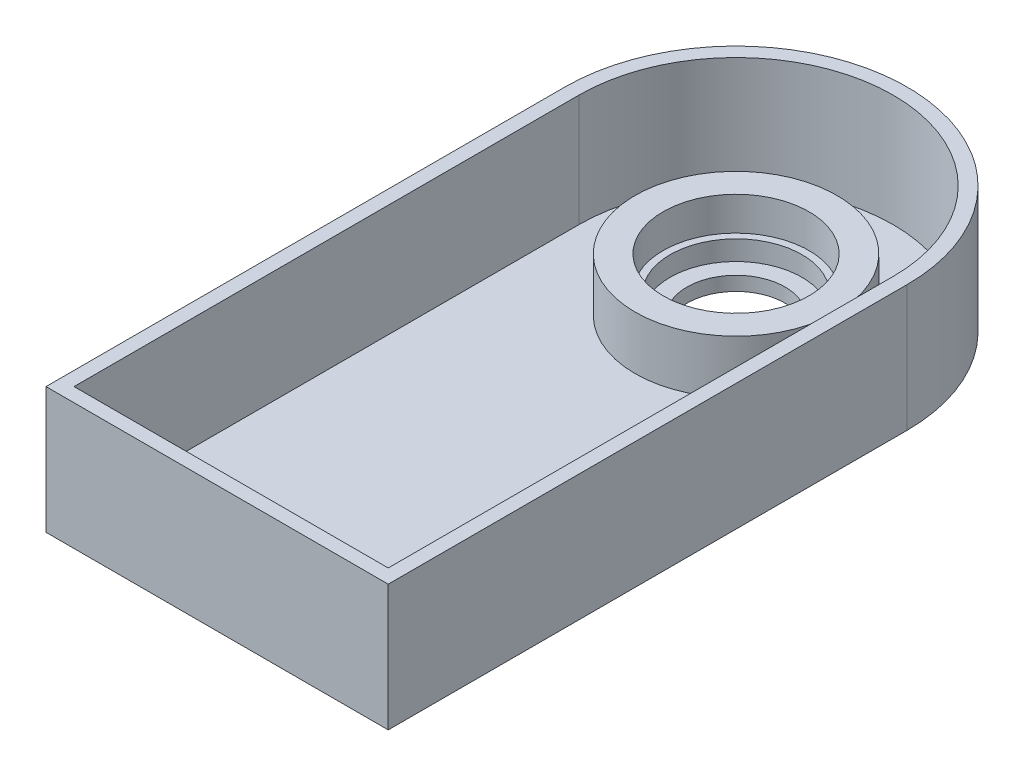
ISO-10303-21;
HEADER;
FILE_DESCRIPTION(('STEP AP214'),'2;1');
FILE_NAME('part.step','',(''),(''),'','','');
FILE_SCHEMA(('AUTOMOTIVE_DESIGN { 1 0 10303 214 1 1 1 1 }'));
ENDSEC;
DATA;
#1=APPLICATION_CONTEXT('core data for automotive mechanical design processes');
#2=APPLICATION_PROTOCOL_DEFINITION('international standard','automotive_design',2000,#1);
#3=PRODUCT_CONTEXT('',#1,'mechanical');
#4=PRODUCT('Part','Part','',(#3));
#5=PRODUCT_RELATED_PRODUCT_CATEGORY('part','',(#4));
#6=PRODUCT_DEFINITION_FORMATION('','',#4);
#7=PRODUCT_DEFINITION_CONTEXT('part definition',#1,'design');
#8=PRODUCT_DEFINITION('design','',#6,#7);
#9=PRODUCT_DEFINITION_SHAPE('','',#8);
#10=(LENGTH_UNIT() NAMED_UNIT(*) SI_UNIT(.MILLI.,.METRE.));
#11=(NAMED_UNIT(*) PLANE_ANGLE_UNIT() SI_UNIT($,.RADIAN.));
#12=(NAMED_UNIT(*) SI_UNIT($,.STERADIAN.) SOLID_ANGLE_UNIT());
#13=UNCERTAINTY_MEASURE_WITH_UNIT(LENGTH_MEASURE(1.E-05),#10,'distance_accuracy_value','');
#14=(GEOMETRIC_REPRESENTATION_CONTEXT(3) GLOBAL_UNCERTAINTY_ASSIGNED_CONTEXT((#13)) GLOBAL_UNIT_ASSIGNED_CONTEXT((#10,
#11,#12)) REPRESENTATION_CONTEXT('',''));
#15=CARTESIAN_POINT('',(0.,0.,0.));
#16=DIRECTION('',(0.,0.,1.));
#17=DIRECTION('',(1.,0.,0.));
#18=AXIS2_PLACEMENT_3D('',#15,#16,#17);
#19=CARTESIAN_POINT('',(0.,5.,0.));
#20=DIRECTION('',(0.,1.,0.));
#21=DIRECTION('',(0.,0.,1.));
#22=AXIS2_PLACEMENT_3D('',#19,#20,#21);
#23=PLANE('',#22);
#24=CARTESIAN_POINT('',(61.,5.,-1.9999999999998));
#25=DIRECTION('',(0.,1.,0.));
#26=DIRECTION('',(0.,0.,1.));
#27=AXIS2_PLACEMENT_3D('',#24,#25,#26);
#28=CIRCLE('',#27,17.5);
#29=CARTESIAN_POINT('',(61.,5.,15.5000000000002));
#30=VERTEX_POINT('',#29);
#31=EDGE_CURVE('E160',#30,#30,#28,.T.);
#32=ORIENTED_EDGE('',*,*,#31,.F.);
#33=EDGE_LOOP('',(#32));
#34=FACE_BOUND('',#33,.T.);
#35=CARTESIAN_POINT('',(61.,5.,-1.9999999999998));
#36=DIRECTION('',(0.,1.,0.));
#37=DIRECTION('',(0.,0.,1.));
#38=AXIS2_PLACEMENT_3D('',#35,#36,#37);
#39=CIRCLE('',#38,23.5);
#40=CARTESIAN_POINT('',(61.,5.,21.5000000000002));
#41=VERTEX_POINT('',#40);
#42=EDGE_CURVE('E12',#41,#41,#39,.F.);
#43=ORIENTED_EDGE('',*,*,#42,.F.);
#44=EDGE_LOOP('',(#43));
#45=FACE_BOUND('',#44,.T.);
#46=ADVANCED_FACE('F62',(#34,#45),#23,.T.);
#47=CARTESIAN_POINT('',(0.,5.,0.));
#48=DIRECTION('',(-1.,0.,0.));
#49=DIRECTION('',(0.,0.,1.));
#50=AXIS2_PLACEMENT_3D('',#47,#48,#49);
#51=PLANE('',#50);
#52=DIRECTION('',(0.,0.,-1.));
#53=VECTOR('',#52,1.);
#54=CARTESIAN_POINT('',(0.,0.,0.));
#55=LINE('',#54,#53);
#56=CARTESIAN_POINT('',(0.,0.,183.));
#57=VERTEX_POINT('',#56);
#58=CARTESIAN_POINT('',(0.,0.,-2.));
#59=VERTEX_POINT('',#58);
#60=EDGE_CURVE('E194',#57,#59,#55,.T.);
#61=ORIENTED_EDGE('',*,*,#60,.F.);
#62=DIRECTION('',(0.,-1.,0.));
#63=VECTOR('',#62,1.);
#64=CARTESIAN_POINT('',(0.,5.,183.));
#65=LINE('',#64,#63);
#66=CARTESIAN_POINT('',(0.,45.,183.));
#67=VERTEX_POINT('',#66);
#68=EDGE_CURVE('E199',#67,#57,#65,.T.);
#69=ORIENTED_EDGE('',*,*,#68,.F.);
#70=DIRECTION('',(0.,0.,1.));
#71=VECTOR('',#70,1.);
#72=CARTESIAN_POINT('',(0.,45.,0.));
#73=LINE('',#72,#71);
#74=CARTESIAN_POINT('',(0.,45.,-2.));
#75=VERTEX_POINT('',#74);
#76=EDGE_CURVE('E149',#75,#67,#73,.T.);
#77=ORIENTED_EDGE('',*,*,#76,.F.);
#78=DIRECTION('',(0.,-1.,0.));
#79=VECTOR('',#78,1.);
#80=CARTESIAN_POINT('',(0.,5.,-2.));
#81=LINE('',#80,#79);
#82=EDGE_CURVE('E73',#75,#59,#81,.T.);
#83=ORIENTED_EDGE('',*,*,#82,.T.);
#84=EDGE_LOOP('',(#61,#69,#77,#83));
#85=FACE_BOUND('',#84,.T.);
#86=ADVANCED_FACE('F244',(#85),#51,.T.);
#87=CARTESIAN_POINT('',(0.,0.,0.));
#88=DIRECTION('',(0.,1.,0.));
#89=DIRECTION('',(0.,0.,1.));
#90=AXIS2_PLACEMENT_3D('',#87,#88,#89);
#91=PLANE('',#90);
#92=CARTESIAN_POINT('',(61.,0.,-1.9999999999998));
#93=DIRECTION('',(0.,1.,0.));
#94=DIRECTION('',(0.,0.,1.));
#95=AXIS2_PLACEMENT_3D('',#92,#93,#94);
#96=CIRCLE('',#95,17.5);
#97=CARTESIAN_POINT('',(61.,0.,15.5000000000002));
#98=VERTEX_POINT('',#97);
#99=EDGE_CURVE('E176',#98,#98,#96,.T.);
#100=ORIENTED_EDGE('',*,*,#99,.T.);
#101=EDGE_LOOP('',(#100));
#102=FACE_BOUND('',#101,.T.);
#103=CARTESIAN_POINT('',(61.,0.,-2.00000000000001));
#104=DIRECTION('',(0.,1.,0.));
#105=DIRECTION('',(0.,0.,1.));
#106=AXIS2_PLACEMENT_3D('',#103,#104,#105);
#107=CIRCLE('',#106,61.);
#108=CARTESIAN_POINT('',(122.,0.,-2.));
#109=VERTEX_POINT('',#108);
#110=EDGE_CURVE('E186',#59,#109,#107,.F.);
#111=ORIENTED_EDGE('',*,*,#110,.T.);
#112=DIRECTION('',(0.,0.,-1.));
#113=VECTOR('',#112,1.);
#114=CARTESIAN_POINT('',(122.,0.,0.));
#115=LINE('',#114,#113);
#116=CARTESIAN_POINT('',(122.,0.,183.));
#117=VERTEX_POINT('',#116);
#118=EDGE_CURVE('E131',#117,#109,#115,.T.);
#119=ORIENTED_EDGE('',*,*,#118,.F.);
#120=DIRECTION('',(-1.,0.,0.));
#121=VECTOR('',#120,1.);
#122=CARTESIAN_POINT('',(0.,0.,183.));
#123=LINE('',#122,#121);
#124=EDGE_CURVE('E193',#117,#57,#123,.T.);
#125=ORIENTED_EDGE('',*,*,#124,.T.);
#126=ORIENTED_EDGE('',*,*,#60,.T.);
#127=EDGE_LOOP('',(#111,#119,#125,#126));
#128=FACE_BOUND('',#127,.T.);
#129=ADVANCED_FACE('F248',(#102,#128),#91,.F.);
#130=CARTESIAN_POINT('',(61.,5.,-2.00000000000001));
#131=DIRECTION('',(0.,-1.,0.));
#132=DIRECTION('',(0.,0.,-1.));
#133=AXIS2_PLACEMENT_3D('',#130,#131,#132);
#134=CYLINDRICAL_SURFACE('',#133,61.);
#135=ORIENTED_EDGE('',*,*,#110,.F.);
#136=ORIENTED_EDGE('',*,*,#82,.F.);
#137=CARTESIAN_POINT('',(61.,45.,-2.00000000000001));
#138=DIRECTION('',(0.,1.,0.));
#139=DIRECTION('',(0.,0.,1.));
#140=AXIS2_PLACEMENT_3D('',#137,#138,#139);
#141=CIRCLE('',#140,61.);
#142=CARTESIAN_POINT('',(122.,45.,-2.));
#143=VERTEX_POINT('',#142);
#144=EDGE_CURVE('E145',#143,#75,#141,.T.);
#145=ORIENTED_EDGE('',*,*,#144,.F.);
#146=DIRECTION('',(0.,-1.,0.));
#147=VECTOR('',#146,1.);
#148=CARTESIAN_POINT('',(122.,5.,-2.));
#149=LINE('',#148,#147);
#150=EDGE_CURVE('E128',#143,#109,#149,.T.);
#151=ORIENTED_EDGE('',*,*,#150,.T.);
#152=EDGE_LOOP('',(#135,#136,#145,#151));
#153=FACE_BOUND('',#152,.T.);
#154=ADVANCED_FACE('F70',(#153),#134,.T.);
#155=CARTESIAN_POINT('',(122.,5.,0.));
#156=DIRECTION('',(-1.,0.,0.));
#157=DIRECTION('',(0.,0.,1.));
#158=AXIS2_PLACEMENT_3D('',#155,#156,#157);
#159=PLANE('',#158);
#160=ORIENTED_EDGE('',*,*,#118,.T.);
#161=ORIENTED_EDGE('',*,*,#150,.F.);
#162=DIRECTION('',(0.,0.,-1.));
#163=VECTOR('',#162,1.);
#164=CARTESIAN_POINT('',(122.,45.,0.));
#165=LINE('',#164,#163);
#166=CARTESIAN_POINT('',(122.,45.,183.));
#167=VERTEX_POINT('',#166);
#168=EDGE_CURVE('E133',#167,#143,#165,.T.);
#169=ORIENTED_EDGE('',*,*,#168,.F.);
#170=DIRECTION('',(0.,-1.,0.));
#171=VECTOR('',#170,1.);
#172=CARTESIAN_POINT('',(122.,5.,183.));
#173=LINE('',#172,#171);
#174=EDGE_CURVE('E137',#167,#117,#173,.T.);
#175=ORIENTED_EDGE('',*,*,#174,.T.);
#176=EDGE_LOOP('',(#160,#161,#169,#175));
#177=FACE_BOUND('',#176,.T.);
#178=ADVANCED_FACE('F132',(#177),#159,.F.);
#179=CARTESIAN_POINT('',(0.,5.,183.));
#180=DIRECTION('',(0.,0.,1.));
#181=DIRECTION('',(1.,0.,0.));
#182=AXIS2_PLACEMENT_3D('',#179,#180,#181);
#183=PLANE('',#182);
#184=ORIENTED_EDGE('',*,*,#124,.F.);
#185=ORIENTED_EDGE('',*,*,#174,.F.);
#186=DIRECTION('',(1.,0.,0.));
#187=VECTOR('',#186,1.);
#188=CARTESIAN_POINT('',(0.,45.,183.));
#189=LINE('',#188,#187);
#190=EDGE_CURVE('E155',#67,#167,#189,.T.);
#191=ORIENTED_EDGE('',*,*,#190,.F.);
#192=ORIENTED_EDGE('',*,*,#68,.T.);
#193=EDGE_LOOP('',(#184,#185,#191,#192));
#194=FACE_BOUND('',#193,.T.);
#195=ADVANCED_FACE('F269',(#194),#183,.T.);
#196=CARTESIAN_POINT('',(5.,45.,0.));
#197=DIRECTION('',(-1.,0.,0.));
#198=DIRECTION('',(0.,0.,1.));
#199=AXIS2_PLACEMENT_3D('',#196,#197,#198);
#200=PLANE('',#199);
#201=DIRECTION('',(0.,0.,-1.));
#202=VECTOR('',#201,1.);
#203=CARTESIAN_POINT('',(5.,5.,0.));
#204=LINE('',#203,#202);
#205=CARTESIAN_POINT('',(5.,5.,178.));
#206=VERTEX_POINT('',#205);
#207=CARTESIAN_POINT('',(5.,5.,-2.));
#208=VERTEX_POINT('',#207);
#209=EDGE_CURVE('E78',#206,#208,#204,.T.);
#210=ORIENTED_EDGE('',*,*,#209,.T.);
#211=DIRECTION('',(0.,-1.,0.));
#212=VECTOR('',#211,1.);
#213=CARTESIAN_POINT('',(5.,45.,-2.));
#214=LINE('',#213,#212);
#215=CARTESIAN_POINT('',(5.,45.,-2.));
#216=VERTEX_POINT('',#215);
#217=EDGE_CURVE('E187',#216,#208,#214,.T.);
#218=ORIENTED_EDGE('',*,*,#217,.F.);
#219=DIRECTION('',(0.,0.,-1.));
#220=VECTOR('',#219,1.);
#221=CARTESIAN_POINT('',(5.,45.,0.));
#222=LINE('',#221,#220);
#223=CARTESIAN_POINT('',(5.,45.,178.));
#224=VERTEX_POINT('',#223);
#225=EDGE_CURVE('E162',#224,#216,#222,.T.);
#226=ORIENTED_EDGE('',*,*,#225,.F.);
#227=DIRECTION('',(0.,-1.,0.));
#228=VECTOR('',#227,1.);
#229=CARTESIAN_POINT('',(5.,45.,178.));
#230=LINE('',#229,#228);
#231=EDGE_CURVE('E173',#224,#206,#230,.T.);
#232=ORIENTED_EDGE('',*,*,#231,.T.);
#233=EDGE_LOOP('',(#210,#218,#226,#232));
#234=FACE_BOUND('',#233,.T.);
#235=ADVANCED_FACE('F275',(#234),#200,.F.);
#236=CARTESIAN_POINT('',(61.,45.,-1.99999999999999));
#237=DIRECTION('',(0.,-1.,0.));
#238=DIRECTION('',(0.,0.,-1.));
#239=AXIS2_PLACEMENT_3D('',#236,#237,#238);
#240=CYLINDRICAL_SURFACE('',#239,56.);
#241=CARTESIAN_POINT('',(61.,5.,-1.99999999999999));
#242=DIRECTION('',(0.,1.,0.));
#243=DIRECTION('',(0.,0.,1.));
#244=AXIS2_PLACEMENT_3D('',#241,#242,#243);
#245=CIRCLE('',#244,56.);
#246=CARTESIAN_POINT('',(117.,5.,-2.));
#247=VERTEX_POINT('',#246);
#248=EDGE_CURVE('E174',#208,#247,#245,.F.);
#249=ORIENTED_EDGE('',*,*,#248,.T.);
#250=DIRECTION('',(0.,-1.,0.));
#251=VECTOR('',#250,1.);
#252=CARTESIAN_POINT('',(117.,45.,-2.));
#253=LINE('',#252,#251);
#254=CARTESIAN_POINT('',(117.,45.,-2.));
#255=VERTEX_POINT('',#254);
#256=EDGE_CURVE('E182',#255,#247,#253,.T.);
#257=ORIENTED_EDGE('',*,*,#256,.F.);
#258=CARTESIAN_POINT('',(61.,45.,-1.99999999999999));
#259=DIRECTION('',(0.,1.,0.));
#260=DIRECTION('',(0.,0.,1.));
#261=AXIS2_PLACEMENT_3D('',#258,#259,#260);
#262=CIRCLE('',#261,56.);
#263=EDGE_CURVE('E164',#216,#255,#262,.F.);
#264=ORIENTED_EDGE('',*,*,#263,.F.);
#265=ORIENTED_EDGE('',*,*,#217,.T.);
#266=EDGE_LOOP('',(#249,#257,#264,#265));
#267=FACE_BOUND('',#266,.T.);
#268=ADVANCED_FACE('F276',(#267),#240,.F.);
#269=CARTESIAN_POINT('',(117.,45.,0.));
#270=DIRECTION('',(-1.,0.,0.));
#271=DIRECTION('',(0.,0.,1.));
#272=AXIS2_PLACEMENT_3D('',#269,#270,#271);
#273=PLANE('',#272);
#274=DIRECTION('',(0.,0.,-1.));
#275=VECTOR('',#274,1.);
#276=CARTESIAN_POINT('',(117.,5.,0.));
#277=LINE('',#276,#275);
#278=CARTESIAN_POINT('',(117.,5.,178.));
#279=VERTEX_POINT('',#278);
#280=EDGE_CURVE('E154',#279,#247,#277,.T.);
#281=ORIENTED_EDGE('',*,*,#280,.F.);
#282=DIRECTION('',(0.,-1.,0.));
#283=VECTOR('',#282,1.);
#284=CARTESIAN_POINT('',(117.,45.,178.));
#285=LINE('',#284,#283);
#286=CARTESIAN_POINT('',(117.,45.,178.));
#287=VERTEX_POINT('',#286);
#288=EDGE_CURVE('E181',#287,#279,#285,.T.);
#289=ORIENTED_EDGE('',*,*,#288,.F.);
#290=DIRECTION('',(0.,0.,-1.));
#291=VECTOR('',#290,1.);
#292=CARTESIAN_POINT('',(117.,45.,0.));
#293=LINE('',#292,#291);
#294=EDGE_CURVE('E170',#287,#255,#293,.T.);
#295=ORIENTED_EDGE('',*,*,#294,.T.);
#296=ORIENTED_EDGE('',*,*,#256,.T.);
#297=EDGE_LOOP('',(#281,#289,#295,#296));
#298=FACE_BOUND('',#297,.T.);
#299=ADVANCED_FACE('F284',(#298),#273,.T.);
#300=CARTESIAN_POINT('',(0.,45.,178.));
#301=DIRECTION('',(0.,0.,-1.));
#302=DIRECTION('',(-1.,0.,0.));
#303=AXIS2_PLACEMENT_3D('',#300,#301,#302);
#304=PLANE('',#303);
#305=DIRECTION('',(1.,0.,0.));
#306=VECTOR('',#305,1.);
#307=CARTESIAN_POINT('',(0.,5.,178.));
#308=LINE('',#307,#306);
#309=EDGE_CURVE('E82',#206,#279,#308,.T.);
#310=ORIENTED_EDGE('',*,*,#309,.F.);
#311=ORIENTED_EDGE('',*,*,#231,.F.);
#312=DIRECTION('',(1.,0.,0.));
#313=VECTOR('',#312,1.);
#314=CARTESIAN_POINT('',(0.,45.,178.));
#315=LINE('',#314,#313);
#316=EDGE_CURVE('E167',#224,#287,#315,.T.);
#317=ORIENTED_EDGE('',*,*,#316,.T.);
#318=ORIENTED_EDGE('',*,*,#288,.T.);
#319=EDGE_LOOP('',(#310,#311,#317,#318));
#320=FACE_BOUND('',#319,.T.);
#321=ADVANCED_FACE('F289',(#320),#304,.T.);
#322=CARTESIAN_POINT('',(0.,45.,0.));
#323=DIRECTION('',(0.,1.,0.));
#324=DIRECTION('',(0.,0.,1.));
#325=AXIS2_PLACEMENT_3D('',#322,#323,#324);
#326=PLANE('',#325);
#327=ORIENTED_EDGE('',*,*,#168,.T.);
#328=ORIENTED_EDGE('',*,*,#144,.T.);
#329=ORIENTED_EDGE('',*,*,#76,.T.);
#330=ORIENTED_EDGE('',*,*,#190,.T.);
#331=EDGE_LOOP('',(#327,#328,#329,#330));
#332=FACE_BOUND('',#331,.T.);
#333=ORIENTED_EDGE('',*,*,#225,.T.);
#334=ORIENTED_EDGE('',*,*,#263,.T.);
#335=ORIENTED_EDGE('',*,*,#294,.F.);
#336=ORIENTED_EDGE('',*,*,#316,.F.);
#337=EDGE_LOOP('',(#333,#334,#335,#336));
#338=FACE_BOUND('',#337,.T.);
#339=ADVANCED_FACE('F148',(#332,#338),#326,.T.);
#340=CARTESIAN_POINT('',(61.,5.,-1.9999999999998));
#341=DIRECTION('',(0.,1.,0.));
#342=DIRECTION('',(0.,0.,1.));
#343=AXIS2_PLACEMENT_3D('',#340,#341,#342);
#344=CIRCLE('',#343,35.9999999999998);
#345=CARTESIAN_POINT('',(61.,5.,34.));
#346=VERTEX_POINT('',#345);
#347=EDGE_CURVE('E217',#346,#346,#344,.T.);
#348=ORIENTED_EDGE('',*,*,#347,.F.);
#349=EDGE_LOOP('',(#348));
#350=FACE_BOUND('',#349,.T.);
#351=ORIENTED_EDGE('',*,*,#209,.F.);
#352=ORIENTED_EDGE('',*,*,#309,.T.);
#353=ORIENTED_EDGE('',*,*,#280,.T.);
#354=ORIENTED_EDGE('',*,*,#248,.F.);
#355=EDGE_LOOP('',(#351,#352,#353,#354));
#356=FACE_BOUND('',#355,.T.);
#357=ADVANCED_FACE('F247',(#350,#356),#23,.T.);
#358=CARTESIAN_POINT('',(61.,-35.,-1.9999999999998));
#359=DIRECTION('',(0.,1.,0.));
#360=DIRECTION('',(0.,0.,1.));
#361=AXIS2_PLACEMENT_3D('',#358,#359,#360);
#362=CYLINDRICAL_SURFACE('',#361,17.5);
#363=ORIENTED_EDGE('',*,*,#31,.T.);
#364=EDGE_LOOP('',(#363));
#365=FACE_BOUND('',#364,.T.);
#366=ORIENTED_EDGE('',*,*,#99,.F.);
#367=EDGE_LOOP('',(#366));
#368=FACE_BOUND('',#367,.T.);
#369=ADVANCED_FACE('F258',(#365,#368),#362,.F.);
#370=CARTESIAN_POINT('',(61.,12.,-1.9999999999998));
#371=DIRECTION('',(0.,1.,0.));
#372=DIRECTION('',(0.,0.,1.));
#373=AXIS2_PLACEMENT_3D('',#370,#371,#372);
#374=PLANE('',#373);
#375=CARTESIAN_POINT('',(61.,12.,-1.9999999999998));
#376=DIRECTION('',(0.,1.,0.));
#377=DIRECTION('',(0.,0.,1.));
#378=AXIS2_PLACEMENT_3D('',#375,#376,#377);
#379=CIRCLE('',#378,25.9999999999998);
#380=CARTESIAN_POINT('',(61.,12.,24.));
#381=VERTEX_POINT('',#380);
#382=EDGE_CURVE('E209',#381,#381,#379,.T.);
#383=ORIENTED_EDGE('',*,*,#382,.T.);
#384=EDGE_LOOP('',(#383));
#385=FACE_BOUND('',#384,.T.);
#386=CARTESIAN_POINT('',(61.,12.,-1.9999999999998));
#387=DIRECTION('',(0.,1.,0.));
#388=DIRECTION('',(0.,0.,1.));
#389=AXIS2_PLACEMENT_3D('',#386,#387,#388);
#390=CIRCLE('',#389,23.5);
#391=CARTESIAN_POINT('',(61.,12.,21.5000000000002));
#392=VERTEX_POINT('',#391);
#393=EDGE_CURVE('E204',#392,#392,#390,.T.);
#394=ORIENTED_EDGE('',*,*,#393,.F.);
#395=EDGE_LOOP('',(#394));
#396=FACE_BOUND('',#395,.T.);
#397=ADVANCED_FACE('F241',(#385,#396),#374,.T.);
#398=CARTESIAN_POINT('',(61.,12.,-1.9999999999998));
#399=DIRECTION('',(0.,-1.,0.));
#400=DIRECTION('',(0.,0.,-1.));
#401=AXIS2_PLACEMENT_3D('',#398,#399,#400);
#402=CYLINDRICAL_SURFACE('',#401,23.5);
#403=ORIENTED_EDGE('',*,*,#393,.T.);
#404=EDGE_LOOP('',(#403));
#405=FACE_BOUND('',#404,.T.);
#406=ORIENTED_EDGE('',*,*,#42,.T.);
#407=EDGE_LOOP('',(#406));
#408=FACE_BOUND('',#407,.T.);
#409=ADVANCED_FACE('F233',(#405,#408),#402,.F.);
#410=CARTESIAN_POINT('',(61.,24.,-1.9999999999998));
#411=DIRECTION('',(0.,-1.,0.));
#412=DIRECTION('',(0.,0.,-1.));
#413=AXIS2_PLACEMENT_3D('',#410,#411,#412);
#414=CYLINDRICAL_SURFACE('',#413,25.9999999999998);
#415=ORIENTED_EDGE('',*,*,#382,.F.);
#416=EDGE_LOOP('',(#415));
#417=FACE_BOUND('',#416,.T.);
#418=CARTESIAN_POINT('',(61.,24.,-1.9999999999998));
#419=DIRECTION('',(0.,1.,0.));
#420=DIRECTION('',(0.,0.,1.));
#421=AXIS2_PLACEMENT_3D('',#418,#419,#420);
#422=CIRCLE('',#421,25.9999999999998);
#423=CARTESIAN_POINT('',(61.,24.,24.));
#424=VERTEX_POINT('',#423);
#425=EDGE_CURVE('E219',#424,#424,#422,.F.);
#426=ORIENTED_EDGE('',*,*,#425,.F.);
#427=EDGE_LOOP('',(#426));
#428=FACE_BOUND('',#427,.T.);
#429=ADVANCED_FACE('F226',(#417,#428),#414,.F.);
#430=CARTESIAN_POINT('',(61.,24.,-1.9999999999998));
#431=DIRECTION('',(0.,-1.,0.));
#432=DIRECTION('',(0.,0.,-1.));
#433=AXIS2_PLACEMENT_3D('',#430,#431,#432);
#434=CYLINDRICAL_SURFACE('',#433,35.9999999999998);
#435=CARTESIAN_POINT('',(61.,24.,-1.9999999999998));
#436=DIRECTION('',(0.,1.,0.));
#437=DIRECTION('',(0.,0.,1.));
#438=AXIS2_PLACEMENT_3D('',#435,#436,#437);
#439=CIRCLE('',#438,35.9999999999998);
#440=CARTESIAN_POINT('',(61.,24.,34.));
#441=VERTEX_POINT('',#440);
#442=EDGE_CURVE('E215',#441,#441,#439,.T.);
#443=ORIENTED_EDGE('',*,*,#442,.F.);
#444=EDGE_LOOP('',(#443));
#445=FACE_BOUND('',#444,.T.);
#446=ORIENTED_EDGE('',*,*,#347,.T.);
#447=EDGE_LOOP('',(#446));
#448=FACE_BOUND('',#447,.T.);
#449=ADVANCED_FACE('F229',(#445,#448),#434,.T.);
#450=CARTESIAN_POINT('',(0.,24.,0.));
#451=DIRECTION('',(0.,1.,0.));
#452=DIRECTION('',(0.,0.,1.));
#453=AXIS2_PLACEMENT_3D('',#450,#451,#452);
#454=PLANE('',#453);
#455=ORIENTED_EDGE('',*,*,#425,.T.);
#456=EDGE_LOOP('',(#455));
#457=FACE_BOUND('',#456,.T.);
#458=ORIENTED_EDGE('',*,*,#442,.T.);
#459=EDGE_LOOP('',(#458));
#460=FACE_BOUND('',#459,.T.);
#461=ADVANCED_FACE('F224',(#457,#460),#454,.T.);
#462=CLOSED_SHELL('',(#46,#86,#129,#154,#178,#195,#235,#268,#299,#321,#339,#357,#369,#397,#409,
#429,#449,#461));
#463=MANIFOLD_SOLID_BREP('B2',#462);
#464=ADVANCED_BREP_SHAPE_REPRESENTATION('',(#18,#463),#14);
#465=SHAPE_DEFINITION_REPRESENTATION(#9,#464);
ENDSEC;
END-ISO-10303-21;
